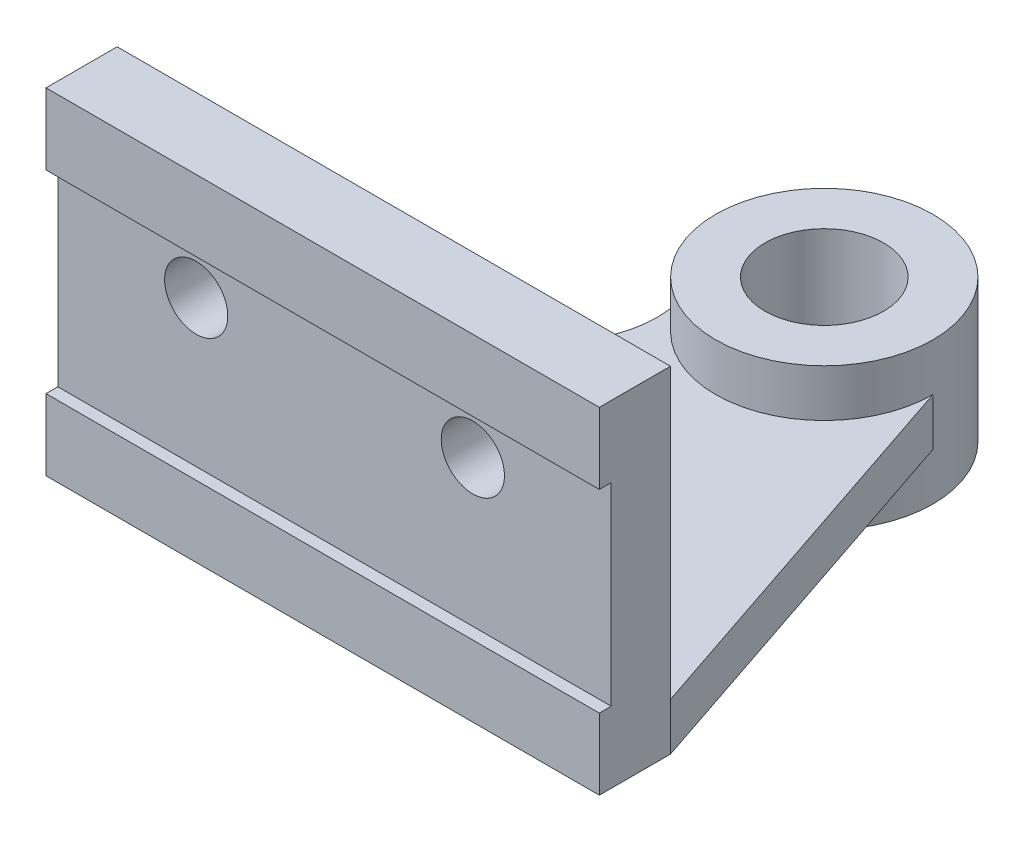
ISO-10303-21;
HEADER;
FILE_DESCRIPTION(('STEP AP214'),'2;1');
FILE_NAME('part.step','',(''),(''),'','','');
FILE_SCHEMA(('AUTOMOTIVE_DESIGN { 1 0 10303 214 1 1 1 1 }'));
ENDSEC;
DATA;
#1=APPLICATION_CONTEXT('core data for automotive mechanical design processes');
#2=APPLICATION_PROTOCOL_DEFINITION('international standard','automotive_design',2000,#1);
#3=PRODUCT_CONTEXT('',#1,'mechanical');
#4=PRODUCT('Part','Part','',(#3));
#5=PRODUCT_RELATED_PRODUCT_CATEGORY('part','',(#4));
#6=PRODUCT_DEFINITION_FORMATION('','',#4);
#7=PRODUCT_DEFINITION_CONTEXT('part definition',#1,'design');
#8=PRODUCT_DEFINITION('design','',#6,#7);
#9=PRODUCT_DEFINITION_SHAPE('','',#8);
#10=(LENGTH_UNIT() NAMED_UNIT(*) SI_UNIT(.MILLI.,.METRE.));
#11=(NAMED_UNIT(*) PLANE_ANGLE_UNIT() SI_UNIT($,.RADIAN.));
#12=(NAMED_UNIT(*) SI_UNIT($,.STERADIAN.) SOLID_ANGLE_UNIT());
#13=UNCERTAINTY_MEASURE_WITH_UNIT(LENGTH_MEASURE(1.E-05),#10,'distance_accuracy_value','');
#14=(GEOMETRIC_REPRESENTATION_CONTEXT(3) GLOBAL_UNCERTAINTY_ASSIGNED_CONTEXT((#13)) GLOBAL_UNIT_ASSIGNED_CONTEXT((#10,
#11,#12)) REPRESENTATION_CONTEXT('',''));
#15=CARTESIAN_POINT('',(0.,0.,0.));
#16=DIRECTION('',(0.,0.,1.));
#17=DIRECTION('',(1.,0.,0.));
#18=AXIS2_PLACEMENT_3D('',#15,#16,#17);
#19=CARTESIAN_POINT('',(0.,79.,118.));
#20=DIRECTION('',(0.,0.,-1.));
#21=DIRECTION('',(-1.,0.,0.));
#22=AXIS2_PLACEMENT_3D('',#19,#20,#21);
#23=PLANE('',#22);
#24=DIRECTION('',(0.,-1.,0.));
#25=VECTOR('',#24,1.);
#26=CARTESIAN_POINT('',(61.0801629988334,79.,118.));
#27=LINE('',#26,#25);
#28=CARTESIAN_POINT('',(61.0801629988334,12.,118.));
#29=VERTEX_POINT('',#28);
#30=CARTESIAN_POINT('',(61.0801629988334,-6.,118.));
#31=VERTEX_POINT('',#30);
#32=EDGE_CURVE('E133',#29,#31,#27,.T.);
#33=ORIENTED_EDGE('',*,*,#32,.F.);
#34=DIRECTION('',(-1.,0.,0.));
#35=VECTOR('',#34,1.);
#36=CARTESIAN_POINT('',(61.0811629988334,12.,118.));
#37=LINE('',#36,#35);
#38=CARTESIAN_POINT('',(-78.9198370011667,12.,118.));
#39=VERTEX_POINT('',#38);
#40=EDGE_CURVE('E175',#29,#39,#37,.T.);
#41=ORIENTED_EDGE('',*,*,#40,.T.);
#42=DIRECTION('',(0.,-1.,0.));
#43=VECTOR('',#42,1.);
#44=CARTESIAN_POINT('',(-78.9198370011667,79.,118.));
#45=LINE('',#44,#43);
#46=CARTESIAN_POINT('',(-78.9198370011667,-6.,118.));
#47=VERTEX_POINT('',#46);
#48=EDGE_CURVE('E160',#39,#47,#45,.T.);
#49=ORIENTED_EDGE('',*,*,#48,.T.);
#50=DIRECTION('',(1.,0.,0.));
#51=VECTOR('',#50,1.);
#52=CARTESIAN_POINT('',(0.,-6.,118.));
#53=LINE('',#52,#51);
#54=EDGE_CURVE('E152',#47,#31,#53,.T.);
#55=ORIENTED_EDGE('',*,*,#54,.T.);
#56=EDGE_LOOP('',(#33,#41,#49,#55));
#57=FACE_BOUND('',#56,.T.);
#58=ADVANCED_FACE('F39',(#57),#23,.F.);
#59=CARTESIAN_POINT('',(-58.9198370011667,18.,62.));
#60=DIRECTION('',(0.,-1.,0.));
#61=DIRECTION('',(0.,0.,-1.));
#62=AXIS2_PLACEMENT_3D('',#59,#60,#61);
#63=CYLINDRICAL_SURFACE('',#62,9.00000000000001);
#64=CARTESIAN_POINT('',(-58.9198370011667,18.,62.));
#65=DIRECTION('',(0.,1.,0.));
#66=DIRECTION('',(0.,0.,1.));
#67=AXIS2_PLACEMENT_3D('',#64,#65,#66);
#68=CIRCLE('',#67,9.00000000000001);
#69=CARTESIAN_POINT('',(-58.9198370011667,18.,71.));
#70=VERTEX_POINT('',#69);
#71=EDGE_CURVE('E220',#70,#70,#68,.T.);
#72=ORIENTED_EDGE('',*,*,#71,.T.);
#73=EDGE_LOOP('',(#72));
#74=FACE_BOUND('',#73,.T.);
#75=CARTESIAN_POINT('',(-58.9198370011667,-6.,62.));
#76=DIRECTION('',(0.,-1.,0.));
#77=DIRECTION('',(0.,0.,-1.));
#78=AXIS2_PLACEMENT_3D('',#75,#76,#77);
#79=CIRCLE('',#78,9.00000000000002);
#80=CARTESIAN_POINT('',(-58.9198370011667,-6.,53.));
#81=VERTEX_POINT('',#80);
#82=EDGE_CURVE('E215',#81,#81,#79,.T.);
#83=ORIENTED_EDGE('',*,*,#82,.T.);
#84=EDGE_LOOP('',(#83));
#85=FACE_BOUND('',#84,.T.);
#86=ADVANCED_FACE('F282',(#74,#85),#63,.F.);
#87=CARTESIAN_POINT('',(-58.9198370011667,18.,62.));
#88=DIRECTION('',(0.,-1.,0.));
#89=DIRECTION('',(0.,0.,-1.));
#90=AXIS2_PLACEMENT_3D('',#87,#88,#89);
#91=CYLINDRICAL_SURFACE('',#90,20.);
#92=CARTESIAN_POINT('',(-58.9198370011667,18.,62.));
#93=DIRECTION('',(0.,1.,0.));
#94=DIRECTION('',(0.,0.,1.));
#95=AXIS2_PLACEMENT_3D('',#92,#93,#94);
#96=CIRCLE('',#95,20.);
#97=CARTESIAN_POINT('',(-58.9198370011667,18.,82.));
#98=VERTEX_POINT('',#97);
#99=EDGE_CURVE('E223',#98,#98,#96,.T.);
#100=ORIENTED_EDGE('',*,*,#99,.F.);
#101=EDGE_LOOP('',(#100));
#102=FACE_BOUND('',#101,.T.);
#103=CARTESIAN_POINT('',(-58.9198370011667,-6.,62.));
#104=DIRECTION('',(0.,-1.,0.));
#105=DIRECTION('',(0.,0.,-1.));
#106=AXIS2_PLACEMENT_3D('',#103,#104,#105);
#107=CIRCLE('',#106,20.);
#108=CARTESIAN_POINT('',(-78.9198370011667,-6.,62.));
#109=VERTEX_POINT('',#108);
#110=CARTESIAN_POINT('',(-54.6458679654331,-6.,42.4620065338943));
#111=VERTEX_POINT('',#110);
#112=EDGE_CURVE('E218',#109,#111,#107,.T.);
#113=ORIENTED_EDGE('',*,*,#112,.F.);
#114=DIRECTION('',(0.,-1.,0.));
#115=VECTOR('',#114,1.);
#116=CARTESIAN_POINT('',(-78.9198370011667,6.,62.));
#117=LINE('',#116,#115);
#118=CARTESIAN_POINT('',(-78.9198370011667,6.,62.));
#119=VERTEX_POINT('',#118);
#120=EDGE_CURVE('E251',#119,#109,#117,.T.);
#121=ORIENTED_EDGE('',*,*,#120,.F.);
#122=CARTESIAN_POINT('',(-58.9198370011667,6.,62.));
#123=DIRECTION('',(0.,1.,0.));
#124=DIRECTION('',(0.,0.,1.));
#125=AXIS2_PLACEMENT_3D('',#122,#123,#124);
#126=CIRCLE('',#125,20.);
#127=CARTESIAN_POINT('',(-54.6458679654331,6.,42.4620065338943));
#128=VERTEX_POINT('',#127);
#129=EDGE_CURVE('E229',#119,#128,#126,.T.);
#130=ORIENTED_EDGE('',*,*,#129,.T.);
#131=DIRECTION('',(0.,-1.,0.));
#132=VECTOR('',#131,1.);
#133=CARTESIAN_POINT('',(-54.6458679654331,6.,42.4620065338943));
#134=LINE('',#133,#132);
#135=EDGE_CURVE('E254',#128,#111,#134,.T.);
#136=ORIENTED_EDGE('',*,*,#135,.T.);
#137=EDGE_LOOP('',(#113,#121,#130,#136));
#138=FACE_BOUND('',#137,.T.);
#139=ADVANCED_FACE('F288',(#102,#138),#91,.T.);
#140=CARTESIAN_POINT('',(0.,18.,0.));
#141=DIRECTION('',(0.,-1.,0.));
#142=DIRECTION('',(0.,0.,-1.));
#143=AXIS2_PLACEMENT_3D('',#140,#141,#142);
#144=CYLINDRICAL_SURFACE('',#143,15.);
#145=CARTESIAN_POINT('',(0.,18.,0.));
#146=DIRECTION('',(0.,1.,0.));
#147=DIRECTION('',(0.,0.,1.));
#148=AXIS2_PLACEMENT_3D('',#145,#146,#147);
#149=CIRCLE('',#148,15.);
#150=CARTESIAN_POINT('',(0.,18.,15.));
#151=VERTEX_POINT('',#150);
#152=EDGE_CURVE('E48',#151,#151,#149,.T.);
#153=ORIENTED_EDGE('',*,*,#152,.T.);
#154=EDGE_LOOP('',(#153));
#155=FACE_BOUND('',#154,.T.);
#156=CARTESIAN_POINT('',(0.,-18.,0.));
#157=DIRECTION('',(0.,1.,0.));
#158=DIRECTION('',(0.,0.,1.));
#159=AXIS2_PLACEMENT_3D('',#156,#157,#158);
#160=CIRCLE('',#159,15.);
#161=CARTESIAN_POINT('',(0.,-18.,15.));
#162=VERTEX_POINT('',#161);
#163=EDGE_CURVE('E257',#162,#162,#160,.T.);
#164=ORIENTED_EDGE('',*,*,#163,.F.);
#165=EDGE_LOOP('',(#164));
#166=FACE_BOUND('',#165,.T.);
#167=ADVANCED_FACE('F41',(#155,#166),#144,.F.);
#168=CARTESIAN_POINT('',(0.,18.,0.));
#169=DIRECTION('',(0.,-1.,0.));
#170=DIRECTION('',(0.,0.,-1.));
#171=AXIS2_PLACEMENT_3D('',#168,#169,#170);
#172=CYLINDRICAL_SURFACE('',#171,27.5);
#173=DIRECTION('',(0.,-1.,0.));
#174=VECTOR('',#173,1.);
#175=CARTESIAN_POINT('',(-25.8255939704013,6.,9.44926960542299));
#176=LINE('',#175,#174);
#177=CARTESIAN_POINT('',(-25.8255939704013,6.,9.449269605423));
#178=VERTEX_POINT('',#177);
#179=CARTESIAN_POINT('',(-25.8255939704013,-6.,9.44926960542299));
#180=VERTEX_POINT('',#179);
#181=EDGE_CURVE('E64',#178,#180,#176,.T.);
#182=ORIENTED_EDGE('',*,*,#181,.F.);
#183=CARTESIAN_POINT('',(0.,6.,0.));
#184=DIRECTION('',(0.,1.,0.));
#185=DIRECTION('',(0.,0.,1.));
#186=AXIS2_PLACEMENT_3D('',#183,#184,#185);
#187=CIRCLE('',#186,27.5);
#188=CARTESIAN_POINT('',(27.5,6.,0.));
#189=VERTEX_POINT('',#188);
#190=EDGE_CURVE('E239',#178,#189,#187,.T.);
#191=ORIENTED_EDGE('',*,*,#190,.T.);
#192=DIRECTION('',(0.,-1.,0.));
#193=VECTOR('',#192,1.);
#194=CARTESIAN_POINT('',(27.5,6.,0.));
#195=LINE('',#194,#193);
#196=CARTESIAN_POINT('',(27.5,-6.,0.));
#197=VERTEX_POINT('',#196);
#198=EDGE_CURVE('E247',#189,#197,#195,.T.);
#199=ORIENTED_EDGE('',*,*,#198,.T.);
#200=CARTESIAN_POINT('',(0.,-6.,0.));
#201=DIRECTION('',(0.,1.,0.));
#202=DIRECTION('',(0.,0.,1.));
#203=AXIS2_PLACEMENT_3D('',#200,#201,#202);
#204=CIRCLE('',#203,27.5);
#205=EDGE_CURVE('E230',#180,#197,#204,.T.);
#206=ORIENTED_EDGE('',*,*,#205,.F.);
#207=EDGE_LOOP('',(#182,#191,#199,#206));
#208=FACE_BOUND('',#207,.T.);
#209=CARTESIAN_POINT('',(0.,18.,0.));
#210=DIRECTION('',(0.,1.,0.));
#211=DIRECTION('',(0.,0.,1.));
#212=AXIS2_PLACEMENT_3D('',#209,#210,#211);
#213=CIRCLE('',#212,27.5);
#214=CARTESIAN_POINT('',(0.,18.,27.5));
#215=VERTEX_POINT('',#214);
#216=EDGE_CURVE('E11',#215,#215,#213,.T.);
#217=ORIENTED_EDGE('',*,*,#216,.F.);
#218=EDGE_LOOP('',(#217));
#219=FACE_BOUND('',#218,.T.);
#220=CARTESIAN_POINT('',(0.,-18.,0.));
#221=DIRECTION('',(0.,1.,0.));
#222=DIRECTION('',(0.,0.,1.));
#223=AXIS2_PLACEMENT_3D('',#220,#221,#222);
#224=CIRCLE('',#223,27.5);
#225=CARTESIAN_POINT('',(0.,-18.,27.5));
#226=VERTEX_POINT('',#225);
#227=EDGE_CURVE('E43',#226,#226,#224,.T.);
#228=ORIENTED_EDGE('',*,*,#227,.T.);
#229=EDGE_LOOP('',(#228));
#230=FACE_BOUND('',#229,.T.);
#231=ADVANCED_FACE('F265',(#208,#219,#230),#172,.T.);
#232=CARTESIAN_POINT('',(0.,18.,0.));
#233=DIRECTION('',(0.,1.,0.));
#234=DIRECTION('',(0.,0.,1.));
#235=AXIS2_PLACEMENT_3D('',#232,#233,#234);
#236=PLANE('',#235);
#237=ORIENTED_EDGE('',*,*,#152,.F.);
#238=EDGE_LOOP('',(#237));
#239=FACE_BOUND('',#238,.T.);
#240=ORIENTED_EDGE('',*,*,#216,.T.);
#241=EDGE_LOOP('',(#240));
#242=FACE_BOUND('',#241,.T.);
#243=ADVANCED_FACE('F270',(#239,#242),#236,.T.);
#244=CARTESIAN_POINT('',(0.,-18.,0.));
#245=DIRECTION('',(0.,1.,0.));
#246=DIRECTION('',(0.,0.,1.));
#247=AXIS2_PLACEMENT_3D('',#244,#245,#246);
#248=PLANE('',#247);
#249=ORIENTED_EDGE('',*,*,#163,.T.);
#250=EDGE_LOOP('',(#249));
#251=FACE_BOUND('',#250,.T.);
#252=ORIENTED_EDGE('',*,*,#227,.F.);
#253=EDGE_LOOP('',(#252));
#254=FACE_BOUND('',#253,.T.);
#255=ADVANCED_FACE('F267',(#251,#254),#248,.F.);
#256=CARTESIAN_POINT('',(-49.3034066707662,6.,18.0395147012621));
#257=DIRECTION('',(0.,-1.,0.));
#258=DIRECTION('',(0.,0.,-1.));
#259=AXIS2_PLACEMENT_3D('',#256,#257,#258);
#260=CYLINDRICAL_SURFACE('',#259,25.);
#261=CARTESIAN_POINT('',(-49.3034066707662,-6.,18.0395147012621));
#262=DIRECTION('',(0.,1.,0.));
#263=DIRECTION('',(0.,0.,1.));
#264=AXIS2_PLACEMENT_3D('',#261,#262,#263);
#265=CIRCLE('',#264,25.);
#266=EDGE_CURVE('E226',#111,#180,#265,.T.);
#267=ORIENTED_EDGE('',*,*,#266,.F.);
#268=ORIENTED_EDGE('',*,*,#135,.F.);
#269=CARTESIAN_POINT('',(-49.3034066707662,6.,18.0395147012621));
#270=DIRECTION('',(0.,1.,0.));
#271=DIRECTION('',(0.,0.,1.));
#272=AXIS2_PLACEMENT_3D('',#269,#270,#271);
#273=CIRCLE('',#272,25.);
#274=EDGE_CURVE('E227',#128,#178,#273,.T.);
#275=ORIENTED_EDGE('',*,*,#274,.T.);
#276=ORIENTED_EDGE('',*,*,#181,.T.);
#277=EDGE_LOOP('',(#267,#268,#275,#276));
#278=FACE_BOUND('',#277,.T.);
#279=ADVANCED_FACE('F269',(#278),#260,.F.);
#280=CARTESIAN_POINT('',(-78.9198370011667,6.,0.));
#281=DIRECTION('',(1.,0.,0.));
#282=DIRECTION('',(0.,0.,-1.));
#283=AXIS2_PLACEMENT_3D('',#280,#281,#282);
#284=PLANE('',#283);
#285=DIRECTION('',(0.,0.,1.));
#286=VECTOR('',#285,1.);
#287=CARTESIAN_POINT('',(-78.9198370011667,-6.,0.));
#288=LINE('',#287,#286);
#289=EDGE_CURVE('E242',#109,#47,#288,.T.);
#290=ORIENTED_EDGE('',*,*,#289,.T.);
#291=ORIENTED_EDGE('',*,*,#48,.F.);
#292=DIRECTION('',(0.,0.,1.));
#293=VECTOR('',#292,1.);
#294=CARTESIAN_POINT('',(-78.9198370011667,12.,115.));
#295=LINE('',#294,#293);
#296=CARTESIAN_POINT('',(-78.9198370011667,12.,115.));
#297=VERTEX_POINT('',#296);
#298=EDGE_CURVE('E172',#297,#39,#295,.T.);
#299=ORIENTED_EDGE('',*,*,#298,.F.);
#300=DIRECTION('',(0.,-1.,0.));
#301=VECTOR('',#300,1.);
#302=CARTESIAN_POINT('',(-78.9198370011667,61.,115.));
#303=LINE('',#302,#301);
#304=CARTESIAN_POINT('',(-78.9198370011667,61.,115.));
#305=VERTEX_POINT('',#304);
#306=EDGE_CURVE('E169',#305,#297,#303,.T.);
#307=ORIENTED_EDGE('',*,*,#306,.F.);
#308=DIRECTION('',(0.,0.,-1.));
#309=VECTOR('',#308,1.);
#310=CARTESIAN_POINT('',(-78.9198370011667,61.,118.));
#311=LINE('',#310,#309);
#312=CARTESIAN_POINT('',(-78.9198370011667,61.,118.));
#313=VERTEX_POINT('',#312);
#314=EDGE_CURVE('E166',#313,#305,#311,.T.);
#315=ORIENTED_EDGE('',*,*,#314,.F.);
#316=CARTESIAN_POINT('',(-78.9198370011667,79.,118.));
#317=VERTEX_POINT('',#316);
#318=EDGE_CURVE('E206',#317,#313,#45,.T.);
#319=ORIENTED_EDGE('',*,*,#318,.F.);
#320=DIRECTION('',(0.,0.,1.));
#321=VECTOR('',#320,1.);
#322=CARTESIAN_POINT('',(-78.9198370011667,79.,0.));
#323=LINE('',#322,#321);
#324=CARTESIAN_POINT('',(-78.9198370011667,79.,100.));
#325=VERTEX_POINT('',#324);
#326=EDGE_CURVE('E204',#325,#317,#323,.T.);
#327=ORIENTED_EDGE('',*,*,#326,.F.);
#328=DIRECTION('',(0.,-1.,0.));
#329=VECTOR('',#328,1.);
#330=CARTESIAN_POINT('',(-78.9198370011667,79.,100.));
#331=LINE('',#330,#329);
#332=CARTESIAN_POINT('',(-78.9198370011667,6.,100.));
#333=VERTEX_POINT('',#332);
#334=EDGE_CURVE('E209',#325,#333,#331,.T.);
#335=ORIENTED_EDGE('',*,*,#334,.T.);
#336=DIRECTION('',(0.,0.,1.));
#337=VECTOR('',#336,1.);
#338=CARTESIAN_POINT('',(-78.9198370011667,6.,0.));
#339=LINE('',#338,#337);
#340=EDGE_CURVE('E232',#119,#333,#339,.T.);
#341=ORIENTED_EDGE('',*,*,#340,.F.);
#342=ORIENTED_EDGE('',*,*,#120,.T.);
#343=EDGE_LOOP('',(#290,#291,#299,#307,#315,#319,#327,#335,#341,#342));
#344=FACE_BOUND('',#343,.T.);
#345=ADVANCED_FACE('F276',(#344),#284,.F.);
#346=CARTESIAN_POINT('',(24.7132646901087,6.,-8.29875456527162));
#347=DIRECTION('',(0.947978992673048,0.,-0.318332890934308));
#348=DIRECTION('',(-0.318332890934308,0.,-0.947978992673048));
#349=AXIS2_PLACEMENT_3D('',#346,#347,#348);
#350=PLANE('',#349);
#351=DIRECTION('',(0.318332890934308,0.,0.947978992673048));
#352=VECTOR('',#351,1.);
#353=CARTESIAN_POINT('',(24.7132646901087,-6.,-8.29875456527162));
#354=LINE('',#353,#352);
#355=CARTESIAN_POINT('',(61.0801629988334,-6.,100.));
#356=VERTEX_POINT('',#355);
#357=EDGE_CURVE('E155',#197,#356,#354,.T.);
#358=ORIENTED_EDGE('',*,*,#357,.F.);
#359=ORIENTED_EDGE('',*,*,#198,.F.);
#360=DIRECTION('',(0.318332890934308,0.,0.947978992673048));
#361=VECTOR('',#360,1.);
#362=CARTESIAN_POINT('',(24.7132646901087,6.,-8.29875456527162));
#363=LINE('',#362,#361);
#364=CARTESIAN_POINT('',(61.0801629988334,6.,100.));
#365=VERTEX_POINT('',#364);
#366=EDGE_CURVE('E236',#189,#365,#363,.T.);
#367=ORIENTED_EDGE('',*,*,#366,.T.);
#368=DIRECTION('',(0.,-1.,0.));
#369=VECTOR('',#368,1.);
#370=CARTESIAN_POINT('',(61.0801629988334,6.,100.));
#371=LINE('',#370,#369);
#372=EDGE_CURVE('E249',#365,#356,#371,.T.);
#373=ORIENTED_EDGE('',*,*,#372,.T.);
#374=EDGE_LOOP('',(#358,#359,#367,#373));
#375=FACE_BOUND('',#374,.T.);
#376=ADVANCED_FACE('F387',(#375),#350,.T.);
#377=CARTESIAN_POINT('',(0.,6.,0.));
#378=DIRECTION('',(0.,1.,0.));
#379=DIRECTION('',(0.,0.,1.));
#380=AXIS2_PLACEMENT_3D('',#377,#378,#379);
#381=PLANE('',#380);
#382=ORIENTED_EDGE('',*,*,#274,.F.);
#383=ORIENTED_EDGE('',*,*,#129,.F.);
#384=ORIENTED_EDGE('',*,*,#340,.T.);
#385=DIRECTION('',(1.,0.,0.));
#386=VECTOR('',#385,1.);
#387=CARTESIAN_POINT('',(0.,6.,100.));
#388=LINE('',#387,#386);
#389=EDGE_CURVE('E234',#333,#365,#388,.T.);
#390=ORIENTED_EDGE('',*,*,#389,.T.);
#391=ORIENTED_EDGE('',*,*,#366,.F.);
#392=ORIENTED_EDGE('',*,*,#190,.F.);
#393=EDGE_LOOP('',(#382,#383,#384,#390,#391,#392));
#394=FACE_BOUND('',#393,.T.);
#395=ADVANCED_FACE('F325',(#394),#381,.T.);
#396=CARTESIAN_POINT('',(0.,-6.,0.));
#397=DIRECTION('',(0.,1.,0.));
#398=DIRECTION('',(0.,0.,1.));
#399=AXIS2_PLACEMENT_3D('',#396,#397,#398);
#400=PLANE('',#399);
#401=ORIENTED_EDGE('',*,*,#266,.T.);
#402=ORIENTED_EDGE('',*,*,#205,.T.);
#403=ORIENTED_EDGE('',*,*,#357,.T.);
#404=DIRECTION('',(0.,0.,-1.));
#405=VECTOR('',#404,1.);
#406=CARTESIAN_POINT('',(61.0801629988334,-6.,0.));
#407=LINE('',#406,#405);
#408=EDGE_CURVE('E138',#31,#356,#407,.T.);
#409=ORIENTED_EDGE('',*,*,#408,.F.);
#410=ORIENTED_EDGE('',*,*,#54,.F.);
#411=ORIENTED_EDGE('',*,*,#289,.F.);
#412=ORIENTED_EDGE('',*,*,#112,.T.);
#413=EDGE_LOOP('',(#401,#402,#403,#409,#410,#411,#412));
#414=FACE_BOUND('',#413,.T.);
#415=ORIENTED_EDGE('',*,*,#82,.F.);
#416=EDGE_LOOP('',(#415));
#417=FACE_BOUND('',#416,.T.);
#418=ADVANCED_FACE('F149',(#414,#417),#400,.F.);
#419=CARTESIAN_POINT('',(0.,18.,0.));
#420=DIRECTION('',(0.,1.,0.));
#421=DIRECTION('',(0.,0.,1.));
#422=AXIS2_PLACEMENT_3D('',#419,#420,#421);
#423=PLANE('',#422);
#424=ORIENTED_EDGE('',*,*,#71,.F.);
#425=EDGE_LOOP('',(#424));
#426=FACE_BOUND('',#425,.T.);
#427=ORIENTED_EDGE('',*,*,#99,.T.);
#428=EDGE_LOOP('',(#427));
#429=FACE_BOUND('',#428,.T.);
#430=ADVANCED_FACE('F301',(#426,#429),#423,.T.);
#431=CARTESIAN_POINT('',(0.,79.,100.));
#432=DIRECTION('',(0.,0.,-1.));
#433=DIRECTION('',(-1.,0.,0.));
#434=AXIS2_PLACEMENT_3D('',#431,#432,#433);
#435=PLANE('',#434);
#436=CARTESIAN_POINT('',(26.0801629988334,49.,100.));
#437=DIRECTION('',(0.,0.,-1.));
#438=DIRECTION('',(-1.,0.,0.));
#439=AXIS2_PLACEMENT_3D('',#436,#437,#438);
#440=CIRCLE('',#439,8.);
#441=CARTESIAN_POINT('',(18.0801629988334,49.,100.));
#442=VERTEX_POINT('',#441);
#443=EDGE_CURVE('E191',#442,#442,#440,.T.);
#444=ORIENTED_EDGE('',*,*,#443,.F.);
#445=EDGE_LOOP('',(#444));
#446=FACE_BOUND('',#445,.T.);
#447=CARTESIAN_POINT('',(-43.9198370011667,49.,100.));
#448=DIRECTION('',(0.,0.,-1.));
#449=DIRECTION('',(-1.,0.,0.));
#450=AXIS2_PLACEMENT_3D('',#447,#448,#449);
#451=CIRCLE('',#450,8.);
#452=CARTESIAN_POINT('',(-51.9198370011667,49.,100.));
#453=VERTEX_POINT('',#452);
#454=EDGE_CURVE('E190',#453,#453,#451,.T.);
#455=ORIENTED_EDGE('',*,*,#454,.F.);
#456=EDGE_LOOP('',(#455));
#457=FACE_BOUND('',#456,.T.);
#458=ORIENTED_EDGE('',*,*,#389,.F.);
#459=ORIENTED_EDGE('',*,*,#334,.F.);
#460=DIRECTION('',(1.,0.,0.));
#461=VECTOR('',#460,1.);
#462=CARTESIAN_POINT('',(0.,79.,100.));
#463=LINE('',#462,#461);
#464=CARTESIAN_POINT('',(61.0801629988334,79.,100.));
#465=VERTEX_POINT('',#464);
#466=EDGE_CURVE('E201',#325,#465,#463,.T.);
#467=ORIENTED_EDGE('',*,*,#466,.T.);
#468=DIRECTION('',(0.,-1.,0.));
#469=VECTOR('',#468,1.);
#470=CARTESIAN_POINT('',(61.0801629988334,79.,100.));
#471=LINE('',#470,#469);
#472=EDGE_CURVE('E144',#465,#365,#471,.T.);
#473=ORIENTED_EDGE('',*,*,#472,.T.);
#474=EDGE_LOOP('',(#458,#459,#467,#473));
#475=FACE_BOUND('',#474,.T.);
#476=ADVANCED_FACE('F294',(#446,#457,#475),#435,.T.);
#477=ORIENTED_EDGE('',*,*,#318,.T.);
#478=DIRECTION('',(-1.,0.,0.));
#479=VECTOR('',#478,1.);
#480=CARTESIAN_POINT('',(61.0811629988334,61.,118.));
#481=LINE('',#480,#479);
#482=CARTESIAN_POINT('',(61.0801629988334,61.,118.));
#483=VERTEX_POINT('',#482);
#484=EDGE_CURVE('E174',#483,#313,#481,.T.);
#485=ORIENTED_EDGE('',*,*,#484,.F.);
#486=CARTESIAN_POINT('',(61.0801629988334,79.,118.));
#487=VERTEX_POINT('',#486);
#488=EDGE_CURVE('E143',#487,#483,#27,.T.);
#489=ORIENTED_EDGE('',*,*,#488,.F.);
#490=DIRECTION('',(1.,0.,0.));
#491=VECTOR('',#490,1.);
#492=CARTESIAN_POINT('',(0.,79.,118.));
#493=LINE('',#492,#491);
#494=EDGE_CURVE('E194',#317,#487,#493,.T.);
#495=ORIENTED_EDGE('',*,*,#494,.F.);
#496=EDGE_LOOP('',(#477,#485,#489,#495));
#497=FACE_BOUND('',#496,.T.);
#498=ADVANCED_FACE('F284',(#497),#23,.F.);
#499=CARTESIAN_POINT('',(61.0801629988334,79.,0.));
#500=DIRECTION('',(-1.,0.,0.));
#501=DIRECTION('',(0.,0.,1.));
#502=AXIS2_PLACEMENT_3D('',#499,#500,#501);
#503=PLANE('',#502);
#504=DIRECTION('',(0.,1.,0.));
#505=VECTOR('',#504,1.);
#506=CARTESIAN_POINT('',(61.0801629988334,61.,115.));
#507=LINE('',#506,#505);
#508=CARTESIAN_POINT('',(61.0801629988334,12.,115.));
#509=VERTEX_POINT('',#508);
#510=CARTESIAN_POINT('',(61.0801629988334,61.,115.));
#511=VERTEX_POINT('',#510);
#512=EDGE_CURVE('E156',#509,#511,#507,.T.);
#513=ORIENTED_EDGE('',*,*,#512,.F.);
#514=DIRECTION('',(0.,0.,-1.));
#515=VECTOR('',#514,1.);
#516=CARTESIAN_POINT('',(61.0801629988334,12.,115.));
#517=LINE('',#516,#515);
#518=EDGE_CURVE('E56',#29,#509,#517,.T.);
#519=ORIENTED_EDGE('',*,*,#518,.F.);
#520=ORIENTED_EDGE('',*,*,#32,.T.);
#521=ORIENTED_EDGE('',*,*,#408,.T.);
#522=ORIENTED_EDGE('',*,*,#372,.F.);
#523=ORIENTED_EDGE('',*,*,#472,.F.);
#524=DIRECTION('',(0.,0.,-1.));
#525=VECTOR('',#524,1.);
#526=CARTESIAN_POINT('',(61.0801629988334,79.,0.));
#527=LINE('',#526,#525);
#528=EDGE_CURVE('E199',#487,#465,#527,.T.);
#529=ORIENTED_EDGE('',*,*,#528,.F.);
#530=ORIENTED_EDGE('',*,*,#488,.T.);
#531=DIRECTION('',(0.,0.,1.));
#532=VECTOR('',#531,1.);
#533=CARTESIAN_POINT('',(61.0801629988334,61.,118.));
#534=LINE('',#533,#532);
#535=EDGE_CURVE('E177',#511,#483,#534,.T.);
#536=ORIENTED_EDGE('',*,*,#535,.F.);
#537=EDGE_LOOP('',(#513,#519,#520,#521,#522,#523,#529,#530,#536));
#538=FACE_BOUND('',#537,.T.);
#539=ADVANCED_FACE('F136',(#538),#503,.F.);
#540=CARTESIAN_POINT('',(0.,79.,0.));
#541=DIRECTION('',(0.,1.,0.));
#542=DIRECTION('',(0.,0.,1.));
#543=AXIS2_PLACEMENT_3D('',#540,#541,#542);
#544=PLANE('',#543);
#545=ORIENTED_EDGE('',*,*,#494,.T.);
#546=ORIENTED_EDGE('',*,*,#528,.T.);
#547=ORIENTED_EDGE('',*,*,#466,.F.);
#548=ORIENTED_EDGE('',*,*,#326,.T.);
#549=EDGE_LOOP('',(#545,#546,#547,#548));
#550=FACE_BOUND('',#549,.T.);
#551=ADVANCED_FACE('F300',(#550),#544,.T.);
#552=CARTESIAN_POINT('',(-43.9198370011667,49.,118.001));
#553=DIRECTION('',(0.,0.,-1.));
#554=DIRECTION('',(-1.,0.,0.));
#555=AXIS2_PLACEMENT_3D('',#552,#553,#554);
#556=CYLINDRICAL_SURFACE('',#555,8.);
#557=CARTESIAN_POINT('',(-43.9198370011667,49.,115.));
#558=DIRECTION('',(0.,0.,-1.));
#559=DIRECTION('',(-1.,0.,0.));
#560=AXIS2_PLACEMENT_3D('',#557,#558,#559);
#561=CIRCLE('',#560,8.);
#562=CARTESIAN_POINT('',(-51.9198370011667,49.,115.));
#563=VERTEX_POINT('',#562);
#564=EDGE_CURVE('E187',#563,#563,#561,.T.);
#565=ORIENTED_EDGE('',*,*,#564,.F.);
#566=EDGE_LOOP('',(#565));
#567=FACE_BOUND('',#566,.T.);
#568=ORIENTED_EDGE('',*,*,#454,.T.);
#569=EDGE_LOOP('',(#568));
#570=FACE_BOUND('',#569,.T.);
#571=ADVANCED_FACE('F343',(#567,#570),#556,.F.);
#572=CARTESIAN_POINT('',(26.0801629988334,49.,118.001));
#573=DIRECTION('',(0.,0.,-1.));
#574=DIRECTION('',(-1.,0.,0.));
#575=AXIS2_PLACEMENT_3D('',#572,#573,#574);
#576=CYLINDRICAL_SURFACE('',#575,8.);
#577=CARTESIAN_POINT('',(26.0801629988334,49.,115.));
#578=DIRECTION('',(0.,0.,-1.));
#579=DIRECTION('',(-1.,0.,0.));
#580=AXIS2_PLACEMENT_3D('',#577,#578,#579);
#581=CIRCLE('',#580,8.);
#582=CARTESIAN_POINT('',(18.0801629988334,49.,115.));
#583=VERTEX_POINT('',#582);
#584=EDGE_CURVE('E184',#583,#583,#581,.T.);
#585=ORIENTED_EDGE('',*,*,#584,.F.);
#586=EDGE_LOOP('',(#585));
#587=FACE_BOUND('',#586,.T.);
#588=ORIENTED_EDGE('',*,*,#443,.T.);
#589=EDGE_LOOP('',(#588));
#590=FACE_BOUND('',#589,.T.);
#591=ADVANCED_FACE('F340',(#587,#590),#576,.F.);
#592=CARTESIAN_POINT('',(61.0811629988334,12.,115.));
#593=DIRECTION('',(0.,-1.,0.));
#594=DIRECTION('',(0.,0.,-1.));
#595=AXIS2_PLACEMENT_3D('',#592,#593,#594);
#596=PLANE('',#595);
#597=ORIENTED_EDGE('',*,*,#518,.T.);
#598=DIRECTION('',(-1.,0.,0.));
#599=VECTOR('',#598,1.);
#600=CARTESIAN_POINT('',(61.0811629988334,12.,115.));
#601=LINE('',#600,#599);
#602=EDGE_CURVE('E178',#509,#297,#601,.T.);
#603=ORIENTED_EDGE('',*,*,#602,.T.);
#604=ORIENTED_EDGE('',*,*,#298,.T.);
#605=ORIENTED_EDGE('',*,*,#40,.F.);
#606=EDGE_LOOP('',(#597,#603,#604,#605));
#607=FACE_BOUND('',#606,.T.);
#608=ADVANCED_FACE('F330',(#607),#596,.F.);
#609=CARTESIAN_POINT('',(61.0811629988334,61.,118.));
#610=DIRECTION('',(0.,1.,0.));
#611=DIRECTION('',(0.,0.,1.));
#612=AXIS2_PLACEMENT_3D('',#609,#610,#611);
#613=PLANE('',#612);
#614=ORIENTED_EDGE('',*,*,#535,.T.);
#615=ORIENTED_EDGE('',*,*,#484,.T.);
#616=ORIENTED_EDGE('',*,*,#314,.T.);
#617=DIRECTION('',(-1.,0.,0.));
#618=VECTOR('',#617,1.);
#619=CARTESIAN_POINT('',(61.0811629988334,61.,115.));
#620=LINE('',#619,#618);
#621=EDGE_CURVE('E180',#511,#305,#620,.T.);
#622=ORIENTED_EDGE('',*,*,#621,.F.);
#623=EDGE_LOOP('',(#614,#615,#616,#622));
#624=FACE_BOUND('',#623,.T.);
#625=ADVANCED_FACE('F315',(#624),#613,.F.);
#626=CARTESIAN_POINT('',(61.0811629988334,61.,115.));
#627=DIRECTION('',(0.,0.,-1.));
#628=DIRECTION('',(-1.,0.,0.));
#629=AXIS2_PLACEMENT_3D('',#626,#627,#628);
#630=PLANE('',#629);
#631=ORIENTED_EDGE('',*,*,#512,.T.);
#632=ORIENTED_EDGE('',*,*,#621,.T.);
#633=ORIENTED_EDGE('',*,*,#306,.T.);
#634=ORIENTED_EDGE('',*,*,#602,.F.);
#635=EDGE_LOOP('',(#631,#632,#633,#634));
#636=FACE_BOUND('',#635,.T.);
#637=ORIENTED_EDGE('',*,*,#564,.T.);
#638=EDGE_LOOP('',(#637));
#639=FACE_BOUND('',#638,.T.);
#640=ORIENTED_EDGE('',*,*,#584,.T.);
#641=EDGE_LOOP('',(#640));
#642=FACE_BOUND('',#641,.T.);
#643=ADVANCED_FACE('F332',(#636,#639,#642),#630,.F.);
#644=CLOSED_SHELL('',(#58,#86,#139,#167,#231,#243,#255,#279,#345,#376,#395,#418,#430,#476,#498,
#539,#551,#571,#591,#608,#625,#643));
#645=MANIFOLD_SOLID_BREP('B2',#644);
#646=ADVANCED_BREP_SHAPE_REPRESENTATION('',(#18,#645),#14);
#647=SHAPE_DEFINITION_REPRESENTATION(#9,#646);
ENDSEC;
END-ISO-10303-21;
